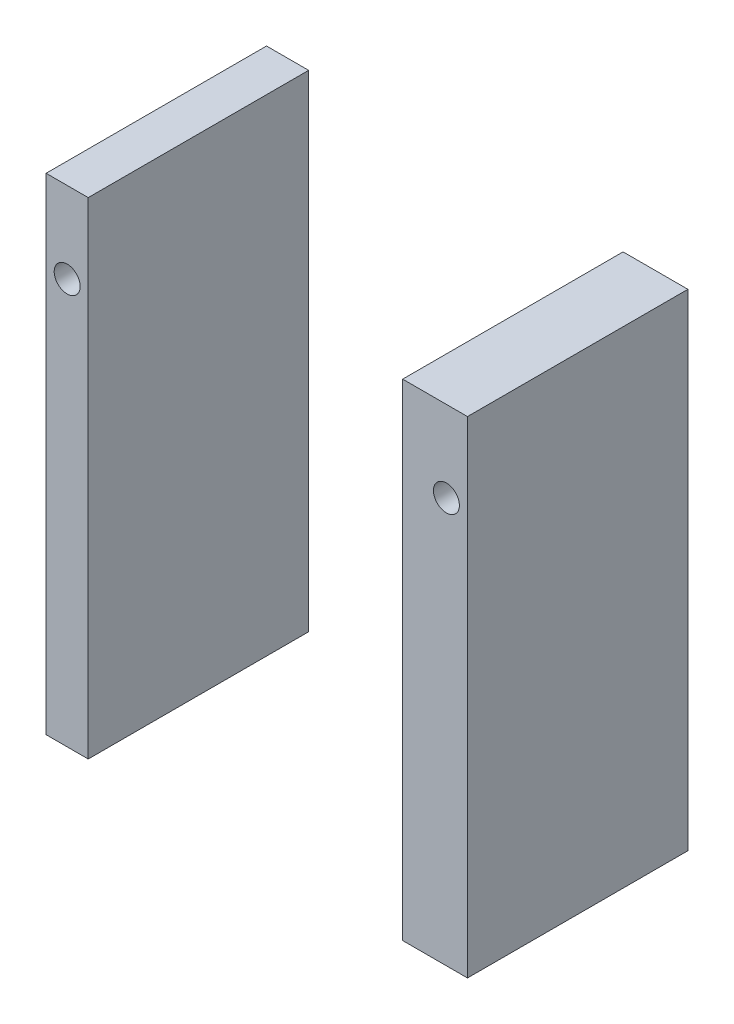
ISO-10303-21;
HEADER;
FILE_DESCRIPTION(('STEP AP214'),'2;1');
FILE_NAME('part.step','',(''),(''),'','','');
FILE_SCHEMA(('AUTOMOTIVE_DESIGN { 1 0 10303 214 1 1 1 1 }'));
ENDSEC;
DATA;
#1=APPLICATION_CONTEXT('core data for automotive mechanical design processes');
#2=APPLICATION_PROTOCOL_DEFINITION('international standard','automotive_design',2000,#1);
#3=PRODUCT_CONTEXT('',#1,'mechanical');
#4=PRODUCT('Part','Part','',(#3));
#5=PRODUCT_RELATED_PRODUCT_CATEGORY('part','',(#4));
#6=PRODUCT_DEFINITION_FORMATION('','',#4);
#7=PRODUCT_DEFINITION_CONTEXT('part definition',#1,'design');
#8=PRODUCT_DEFINITION('design','',#6,#7);
#9=PRODUCT_DEFINITION_SHAPE('','',#8);
#10=(LENGTH_UNIT() NAMED_UNIT(*) SI_UNIT(.MILLI.,.METRE.));
#11=(NAMED_UNIT(*) PLANE_ANGLE_UNIT() SI_UNIT($,.RADIAN.));
#12=(NAMED_UNIT(*) SI_UNIT($,.STERADIAN.) SOLID_ANGLE_UNIT());
#13=UNCERTAINTY_MEASURE_WITH_UNIT(LENGTH_MEASURE(1.E-05),#10,'distance_accuracy_value','');
#14=(GEOMETRIC_REPRESENTATION_CONTEXT(3) GLOBAL_UNCERTAINTY_ASSIGNED_CONTEXT((#13)) GLOBAL_UNIT_ASSIGNED_CONTEXT((#10,
#11,#12)) REPRESENTATION_CONTEXT('',''));
#15=CARTESIAN_POINT('',(0.,0.,0.));
#16=DIRECTION('',(0.,0.,1.));
#17=DIRECTION('',(1.,0.,0.));
#18=AXIS2_PLACEMENT_3D('',#15,#16,#17);
#19=CARTESIAN_POINT('',(11.43,38.1,17.272));
#20=DIRECTION('',(1.,0.,0.));
#21=DIRECTION('',(0.,1.,0.));
#22=AXIS2_PLACEMENT_3D('',#19,#20,#21);
#23=PLANE('',#22);
#24=DIRECTION('',(0.,-1.,0.));
#25=VECTOR('',#24,1.);
#26=CARTESIAN_POINT('',(11.43,38.1,0.));
#27=LINE('',#26,#25);
#28=CARTESIAN_POINT('',(11.43,38.1,0.));
#29=VERTEX_POINT('',#28);
#30=CARTESIAN_POINT('',(11.43,0.,0.));
#31=VERTEX_POINT('',#30);
#32=EDGE_CURVE('E106',#29,#31,#27,.T.);
#33=ORIENTED_EDGE('',*,*,#32,.T.);
#34=DIRECTION('',(0.,0.,-1.));
#35=VECTOR('',#34,1.);
#36=CARTESIAN_POINT('',(11.43,0.,17.272));
#37=LINE('',#36,#35);
#38=CARTESIAN_POINT('',(11.43,0.,17.272));
#39=VERTEX_POINT('',#38);
#40=EDGE_CURVE('E12',#39,#31,#37,.T.);
#41=ORIENTED_EDGE('',*,*,#40,.F.);
#42=DIRECTION('',(0.,-1.,0.));
#43=VECTOR('',#42,1.);
#44=CARTESIAN_POINT('',(11.43,38.1,17.272));
#45=LINE('',#44,#43);
#46=CARTESIAN_POINT('',(11.43,38.1,17.272));
#47=VERTEX_POINT('',#46);
#48=EDGE_CURVE('E94',#47,#39,#45,.T.);
#49=ORIENTED_EDGE('',*,*,#48,.F.);
#50=DIRECTION('',(0.,0.,-1.));
#51=VECTOR('',#50,1.);
#52=CARTESIAN_POINT('',(11.43,38.1,17.272));
#53=LINE('',#52,#51);
#54=EDGE_CURVE('E102',#47,#29,#53,.T.);
#55=ORIENTED_EDGE('',*,*,#54,.T.);
#56=EDGE_LOOP('',(#33,#41,#49,#55));
#57=FACE_BOUND('',#56,.T.);
#58=ADVANCED_FACE('F43',(#57),#23,.F.);
#59=CARTESIAN_POINT('',(11.43,0.,17.272));
#60=DIRECTION('',(0.,1.,0.));
#61=DIRECTION('',(-1.,0.,0.));
#62=AXIS2_PLACEMENT_3D('',#59,#60,#61);
#63=PLANE('',#62);
#64=DIRECTION('',(1.,0.,0.));
#65=VECTOR('',#64,1.);
#66=CARTESIAN_POINT('',(11.43,0.,0.));
#67=LINE('',#66,#65);
#68=CARTESIAN_POINT('',(16.51,0.,0.));
#69=VERTEX_POINT('',#68);
#70=EDGE_CURVE('E98',#31,#69,#67,.T.);
#71=ORIENTED_EDGE('',*,*,#70,.T.);
#72=DIRECTION('',(0.,0.,-1.));
#73=VECTOR('',#72,1.);
#74=CARTESIAN_POINT('',(16.51,0.,17.272));
#75=LINE('',#74,#73);
#76=CARTESIAN_POINT('',(16.51,0.,17.272));
#77=VERTEX_POINT('',#76);
#78=EDGE_CURVE('E51',#77,#69,#75,.T.);
#79=ORIENTED_EDGE('',*,*,#78,.F.);
#80=DIRECTION('',(1.,0.,0.));
#81=VECTOR('',#80,1.);
#82=CARTESIAN_POINT('',(11.43,0.,17.272));
#83=LINE('',#82,#81);
#84=EDGE_CURVE('E89',#39,#77,#83,.T.);
#85=ORIENTED_EDGE('',*,*,#84,.F.);
#86=ORIENTED_EDGE('',*,*,#40,.T.);
#87=EDGE_LOOP('',(#71,#79,#85,#86));
#88=FACE_BOUND('',#87,.T.);
#89=ADVANCED_FACE('F97',(#88),#63,.F.);
#90=CARTESIAN_POINT('',(16.51,38.1,17.272));
#91=DIRECTION('',(-1.,0.,0.));
#92=DIRECTION('',(0.,-1.,0.));
#93=AXIS2_PLACEMENT_3D('',#90,#91,#92);
#94=PLANE('',#93);
#95=DIRECTION('',(0.,1.,0.));
#96=VECTOR('',#95,1.);
#97=CARTESIAN_POINT('',(16.51,38.1,0.));
#98=LINE('',#97,#96);
#99=CARTESIAN_POINT('',(16.51,38.1,0.));
#100=VERTEX_POINT('',#99);
#101=EDGE_CURVE('E76',#69,#100,#98,.T.);
#102=ORIENTED_EDGE('',*,*,#101,.T.);
#103=DIRECTION('',(0.,0.,-1.));
#104=VECTOR('',#103,1.);
#105=CARTESIAN_POINT('',(16.51,38.1,17.272));
#106=LINE('',#105,#104);
#107=CARTESIAN_POINT('',(16.51,38.1,17.272));
#108=VERTEX_POINT('',#107);
#109=EDGE_CURVE('E99',#108,#100,#106,.T.);
#110=ORIENTED_EDGE('',*,*,#109,.F.);
#111=DIRECTION('',(0.,1.,0.));
#112=VECTOR('',#111,1.);
#113=CARTESIAN_POINT('',(16.51,38.1,17.272));
#114=LINE('',#113,#112);
#115=EDGE_CURVE('E92',#77,#108,#114,.T.);
#116=ORIENTED_EDGE('',*,*,#115,.F.);
#117=ORIENTED_EDGE('',*,*,#78,.T.);
#118=EDGE_LOOP('',(#102,#110,#116,#117));
#119=FACE_BOUND('',#118,.T.);
#120=ADVANCED_FACE('F100',(#119),#94,.F.);
#121=CARTESIAN_POINT('',(11.43,38.1,17.272));
#122=DIRECTION('',(0.,-1.,0.));
#123=DIRECTION('',(1.,0.,0.));
#124=AXIS2_PLACEMENT_3D('',#121,#122,#123);
#125=PLANE('',#124);
#126=DIRECTION('',(-1.,0.,0.));
#127=VECTOR('',#126,1.);
#128=CARTESIAN_POINT('',(11.43,38.1,0.));
#129=LINE('',#128,#127);
#130=EDGE_CURVE('E82',#100,#29,#129,.T.);
#131=ORIENTED_EDGE('',*,*,#130,.T.);
#132=ORIENTED_EDGE('',*,*,#54,.F.);
#133=DIRECTION('',(-1.,0.,0.));
#134=VECTOR('',#133,1.);
#135=CARTESIAN_POINT('',(11.43,38.1,17.272));
#136=LINE('',#135,#134);
#137=EDGE_CURVE('E59',#108,#47,#136,.T.);
#138=ORIENTED_EDGE('',*,*,#137,.F.);
#139=ORIENTED_EDGE('',*,*,#109,.T.);
#140=EDGE_LOOP('',(#131,#132,#138,#139));
#141=FACE_BOUND('',#140,.T.);
#142=ADVANCED_FACE('F114',(#141),#125,.F.);
#143=CARTESIAN_POINT('',(0.,0.,17.272));
#144=DIRECTION('',(0.,0.,1.));
#145=DIRECTION('',(1.,0.,0.));
#146=AXIS2_PLACEMENT_3D('',#143,#144,#145);
#147=PLANE('',#146);
#148=CARTESIAN_POINT('',(14.859,31.75,17.272));
#149=DIRECTION('',(0.,0.,1.));
#150=DIRECTION('',(1.,0.,0.));
#151=AXIS2_PLACEMENT_3D('',#148,#149,#150);
#152=CIRCLE('',#151,1.016);
#153=CARTESIAN_POINT('',(15.875,31.75,17.272));
#154=VERTEX_POINT('',#153);
#155=EDGE_CURVE('E120',#154,#154,#152,.T.);
#156=ORIENTED_EDGE('',*,*,#155,.F.);
#157=EDGE_LOOP('',(#156));
#158=FACE_BOUND('',#157,.T.);
#159=ORIENTED_EDGE('',*,*,#48,.T.);
#160=ORIENTED_EDGE('',*,*,#84,.T.);
#161=ORIENTED_EDGE('',*,*,#115,.T.);
#162=ORIENTED_EDGE('',*,*,#137,.T.);
#163=EDGE_LOOP('',(#159,#160,#161,#162));
#164=FACE_BOUND('',#163,.T.);
#165=ADVANCED_FACE('F90',(#158,#164),#147,.T.);
#166=CARTESIAN_POINT('',(0.,0.,0.));
#167=DIRECTION('',(0.,0.,1.));
#168=DIRECTION('',(1.,0.,0.));
#169=AXIS2_PLACEMENT_3D('',#166,#167,#168);
#170=PLANE('',#169);
#171=ORIENTED_EDGE('',*,*,#32,.F.);
#172=ORIENTED_EDGE('',*,*,#130,.F.);
#173=ORIENTED_EDGE('',*,*,#101,.F.);
#174=ORIENTED_EDGE('',*,*,#70,.F.);
#175=EDGE_LOOP('',(#171,#172,#173,#174));
#176=FACE_BOUND('',#175,.T.);
#177=ADVANCED_FACE('F117',(#176),#170,.F.);
#178=CARTESIAN_POINT('',(14.859,31.75,15.24));
#179=DIRECTION('',(0.,0.,1.));
#180=DIRECTION('',(1.,0.,0.));
#181=AXIS2_PLACEMENT_3D('',#178,#179,#180);
#182=CYLINDRICAL_SURFACE('',#181,1.016);
#183=CARTESIAN_POINT('',(14.859,31.75,15.24));
#184=DIRECTION('',(0.,0.,1.));
#185=DIRECTION('',(1.,0.,0.));
#186=AXIS2_PLACEMENT_3D('',#183,#184,#185);
#187=CIRCLE('',#186,1.016);
#188=CARTESIAN_POINT('',(15.875,31.75,15.24));
#189=VERTEX_POINT('',#188);
#190=EDGE_CURVE('E109',#189,#189,#187,.T.);
#191=ORIENTED_EDGE('',*,*,#190,.F.);
#192=EDGE_LOOP('',(#191));
#193=FACE_BOUND('',#192,.T.);
#194=ORIENTED_EDGE('',*,*,#155,.T.);
#195=EDGE_LOOP('',(#194));
#196=FACE_BOUND('',#195,.T.);
#197=ADVANCED_FACE('F128',(#193,#196),#182,.F.);
#198=CARTESIAN_POINT('',(14.859,31.75,15.24));
#199=DIRECTION('',(0.,0.,1.));
#200=DIRECTION('',(1.,0.,0.));
#201=AXIS2_PLACEMENT_3D('',#198,#199,#200);
#202=PLANE('',#201);
#203=ORIENTED_EDGE('',*,*,#190,.T.);
#204=EDGE_LOOP('',(#203));
#205=FACE_BOUND('',#204,.T.);
#206=ADVANCED_FACE('F126',(#205),#202,.T.);
#207=CLOSED_SHELL('',(#58,#89,#120,#142,#165,#177,#197,#206));
#208=MANIFOLD_SOLID_BREP('B2',#207);
#209=CARTESIAN_POINT('',(-16.51,38.1,17.272));
#210=DIRECTION('',(1.,0.,0.));
#211=DIRECTION('',(0.,1.,0.));
#212=AXIS2_PLACEMENT_3D('',#209,#210,#211);
#213=PLANE('',#212);
#214=DIRECTION('',(0.,-1.,0.));
#215=VECTOR('',#214,1.);
#216=CARTESIAN_POINT('',(-16.51,38.1,0.));
#217=LINE('',#216,#215);
#218=CARTESIAN_POINT('',(-16.51,38.1,0.));
#219=VERTEX_POINT('',#218);
#220=CARTESIAN_POINT('',(-16.51,0.,0.));
#221=VERTEX_POINT('',#220);
#222=EDGE_CURVE('E260',#219,#221,#217,.T.);
#223=ORIENTED_EDGE('',*,*,#222,.T.);
#224=DIRECTION('',(0.,0.,-1.));
#225=VECTOR('',#224,1.);
#226=CARTESIAN_POINT('',(-16.51,0.,17.272));
#227=LINE('',#226,#225);
#228=CARTESIAN_POINT('',(-16.51,0.,17.272));
#229=VERTEX_POINT('',#228);
#230=EDGE_CURVE('E41',#229,#221,#227,.T.);
#231=ORIENTED_EDGE('',*,*,#230,.F.);
#232=DIRECTION('',(0.,-1.,0.));
#233=VECTOR('',#232,1.);
#234=CARTESIAN_POINT('',(-16.51,38.1,17.272));
#235=LINE('',#234,#233);
#236=CARTESIAN_POINT('',(-16.51,38.1,17.272));
#237=VERTEX_POINT('',#236);
#238=EDGE_CURVE('E248',#237,#229,#235,.T.);
#239=ORIENTED_EDGE('',*,*,#238,.F.);
#240=DIRECTION('',(0.,0.,-1.));
#241=VECTOR('',#240,1.);
#242=CARTESIAN_POINT('',(-16.51,38.1,17.272));
#243=LINE('',#242,#241);
#244=EDGE_CURVE('E256',#237,#219,#243,.T.);
#245=ORIENTED_EDGE('',*,*,#244,.T.);
#246=EDGE_LOOP('',(#223,#231,#239,#245));
#247=FACE_BOUND('',#246,.T.);
#248=ADVANCED_FACE('F197',(#247),#213,.F.);
#249=CARTESIAN_POINT('',(-16.51,0.,17.272));
#250=DIRECTION('',(0.,1.,0.));
#251=DIRECTION('',(-1.,0.,0.));
#252=AXIS2_PLACEMENT_3D('',#249,#250,#251);
#253=PLANE('',#252);
#254=DIRECTION('',(1.,0.,0.));
#255=VECTOR('',#254,1.);
#256=CARTESIAN_POINT('',(-16.51,0.,0.));
#257=LINE('',#256,#255);
#258=CARTESIAN_POINT('',(-13.208,0.,0.));
#259=VERTEX_POINT('',#258);
#260=EDGE_CURVE('E252',#221,#259,#257,.T.);
#261=ORIENTED_EDGE('',*,*,#260,.T.);
#262=DIRECTION('',(0.,0.,-1.));
#263=VECTOR('',#262,1.);
#264=CARTESIAN_POINT('',(-13.208,0.,17.272));
#265=LINE('',#264,#263);
#266=CARTESIAN_POINT('',(-13.208,0.,17.272));
#267=VERTEX_POINT('',#266);
#268=EDGE_CURVE('E205',#267,#259,#265,.T.);
#269=ORIENTED_EDGE('',*,*,#268,.F.);
#270=DIRECTION('',(1.,0.,0.));
#271=VECTOR('',#270,1.);
#272=CARTESIAN_POINT('',(-16.51,0.,17.272));
#273=LINE('',#272,#271);
#274=EDGE_CURVE('E243',#229,#267,#273,.T.);
#275=ORIENTED_EDGE('',*,*,#274,.F.);
#276=ORIENTED_EDGE('',*,*,#230,.T.);
#277=EDGE_LOOP('',(#261,#269,#275,#276));
#278=FACE_BOUND('',#277,.T.);
#279=ADVANCED_FACE('F251',(#278),#253,.F.);
#280=CARTESIAN_POINT('',(-13.208,38.1,17.272));
#281=DIRECTION('',(-1.,0.,0.));
#282=DIRECTION('',(0.,-1.,0.));
#283=AXIS2_PLACEMENT_3D('',#280,#281,#282);
#284=PLANE('',#283);
#285=DIRECTION('',(0.,1.,0.));
#286=VECTOR('',#285,1.);
#287=CARTESIAN_POINT('',(-13.208,38.1,0.));
#288=LINE('',#287,#286);
#289=CARTESIAN_POINT('',(-13.208,38.1,0.));
#290=VERTEX_POINT('',#289);
#291=EDGE_CURVE('E230',#259,#290,#288,.T.);
#292=ORIENTED_EDGE('',*,*,#291,.T.);
#293=DIRECTION('',(0.,0.,-1.));
#294=VECTOR('',#293,1.);
#295=CARTESIAN_POINT('',(-13.208,38.1,17.272));
#296=LINE('',#295,#294);
#297=CARTESIAN_POINT('',(-13.208,38.1,17.272));
#298=VERTEX_POINT('',#297);
#299=EDGE_CURVE('E253',#298,#290,#296,.T.);
#300=ORIENTED_EDGE('',*,*,#299,.F.);
#301=DIRECTION('',(0.,1.,0.));
#302=VECTOR('',#301,1.);
#303=CARTESIAN_POINT('',(-13.208,38.1,17.272));
#304=LINE('',#303,#302);
#305=EDGE_CURVE('E246',#267,#298,#304,.T.);
#306=ORIENTED_EDGE('',*,*,#305,.F.);
#307=ORIENTED_EDGE('',*,*,#268,.T.);
#308=EDGE_LOOP('',(#292,#300,#306,#307));
#309=FACE_BOUND('',#308,.T.);
#310=ADVANCED_FACE('F254',(#309),#284,.F.);
#311=CARTESIAN_POINT('',(-16.51,38.1,17.272));
#312=DIRECTION('',(0.,-1.,0.));
#313=DIRECTION('',(0.,0.,-1.));
#314=AXIS2_PLACEMENT_3D('',#311,#312,#313);
#315=PLANE('',#314);
#316=DIRECTION('',(-1.,0.,0.));
#317=VECTOR('',#316,1.);
#318=CARTESIAN_POINT('',(-16.51,38.1,0.));
#319=LINE('',#318,#317);
#320=EDGE_CURVE('E236',#290,#219,#319,.T.);
#321=ORIENTED_EDGE('',*,*,#320,.T.);
#322=ORIENTED_EDGE('',*,*,#244,.F.);
#323=DIRECTION('',(-1.,0.,0.));
#324=VECTOR('',#323,1.);
#325=CARTESIAN_POINT('',(-16.51,38.1,17.272));
#326=LINE('',#325,#324);
#327=EDGE_CURVE('E213',#298,#237,#326,.T.);
#328=ORIENTED_EDGE('',*,*,#327,.F.);
#329=ORIENTED_EDGE('',*,*,#299,.T.);
#330=EDGE_LOOP('',(#321,#322,#328,#329));
#331=FACE_BOUND('',#330,.T.);
#332=ADVANCED_FACE('F268',(#331),#315,.F.);
#333=CARTESIAN_POINT('',(0.,0.,17.272));
#334=DIRECTION('',(0.,0.,1.));
#335=DIRECTION('',(1.,0.,0.));
#336=AXIS2_PLACEMENT_3D('',#333,#334,#335);
#337=PLANE('',#336);
#338=CARTESIAN_POINT('',(-14.859,31.75,17.272));
#339=DIRECTION('',(0.,0.,1.));
#340=DIRECTION('',(1.,0.,0.));
#341=AXIS2_PLACEMENT_3D('',#338,#339,#340);
#342=CIRCLE('',#341,1.016);
#343=CARTESIAN_POINT('',(-13.843,31.75,17.272));
#344=VERTEX_POINT('',#343);
#345=EDGE_CURVE('E274',#344,#344,#342,.T.);
#346=ORIENTED_EDGE('',*,*,#345,.F.);
#347=EDGE_LOOP('',(#346));
#348=FACE_BOUND('',#347,.T.);
#349=ORIENTED_EDGE('',*,*,#238,.T.);
#350=ORIENTED_EDGE('',*,*,#274,.T.);
#351=ORIENTED_EDGE('',*,*,#305,.T.);
#352=ORIENTED_EDGE('',*,*,#327,.T.);
#353=EDGE_LOOP('',(#349,#350,#351,#352));
#354=FACE_BOUND('',#353,.T.);
#355=ADVANCED_FACE('F244',(#348,#354),#337,.T.);
#356=CARTESIAN_POINT('',(0.,0.,0.));
#357=DIRECTION('',(0.,0.,1.));
#358=DIRECTION('',(1.,0.,0.));
#359=AXIS2_PLACEMENT_3D('',#356,#357,#358);
#360=PLANE('',#359);
#361=ORIENTED_EDGE('',*,*,#222,.F.);
#362=ORIENTED_EDGE('',*,*,#320,.F.);
#363=ORIENTED_EDGE('',*,*,#291,.F.);
#364=ORIENTED_EDGE('',*,*,#260,.F.);
#365=EDGE_LOOP('',(#361,#362,#363,#364));
#366=FACE_BOUND('',#365,.T.);
#367=ADVANCED_FACE('F271',(#366),#360,.F.);
#368=CARTESIAN_POINT('',(-14.859,31.75,15.24));
#369=DIRECTION('',(0.,0.,1.));
#370=DIRECTION('',(1.,0.,0.));
#371=AXIS2_PLACEMENT_3D('',#368,#369,#370);
#372=CYLINDRICAL_SURFACE('',#371,1.016);
#373=CARTESIAN_POINT('',(-14.859,31.75,15.24));
#374=DIRECTION('',(0.,0.,1.));
#375=DIRECTION('',(1.,0.,0.));
#376=AXIS2_PLACEMENT_3D('',#373,#374,#375);
#377=CIRCLE('',#376,1.016);
#378=CARTESIAN_POINT('',(-13.843,31.75,15.24));
#379=VERTEX_POINT('',#378);
#380=EDGE_CURVE('E263',#379,#379,#377,.T.);
#381=ORIENTED_EDGE('',*,*,#380,.F.);
#382=EDGE_LOOP('',(#381));
#383=FACE_BOUND('',#382,.T.);
#384=ORIENTED_EDGE('',*,*,#345,.T.);
#385=EDGE_LOOP('',(#384));
#386=FACE_BOUND('',#385,.T.);
#387=ADVANCED_FACE('F282',(#383,#386),#372,.F.);
#388=CARTESIAN_POINT('',(-14.859,31.75,15.24));
#389=DIRECTION('',(0.,0.,1.));
#390=DIRECTION('',(1.,0.,0.));
#391=AXIS2_PLACEMENT_3D('',#388,#389,#390);
#392=PLANE('',#391);
#393=ORIENTED_EDGE('',*,*,#380,.T.);
#394=EDGE_LOOP('',(#393));
#395=FACE_BOUND('',#394,.T.);
#396=ADVANCED_FACE('F280',(#395),#392,.T.);
#397=CLOSED_SHELL('',(#248,#279,#310,#332,#355,#367,#387,#396));
#398=MANIFOLD_SOLID_BREP('B6',#397);
#399=ADVANCED_BREP_SHAPE_REPRESENTATION('',(#18,#208,#398),#14);
#400=SHAPE_DEFINITION_REPRESENTATION(#9,#399);
ENDSEC;
END-ISO-10303-21;
